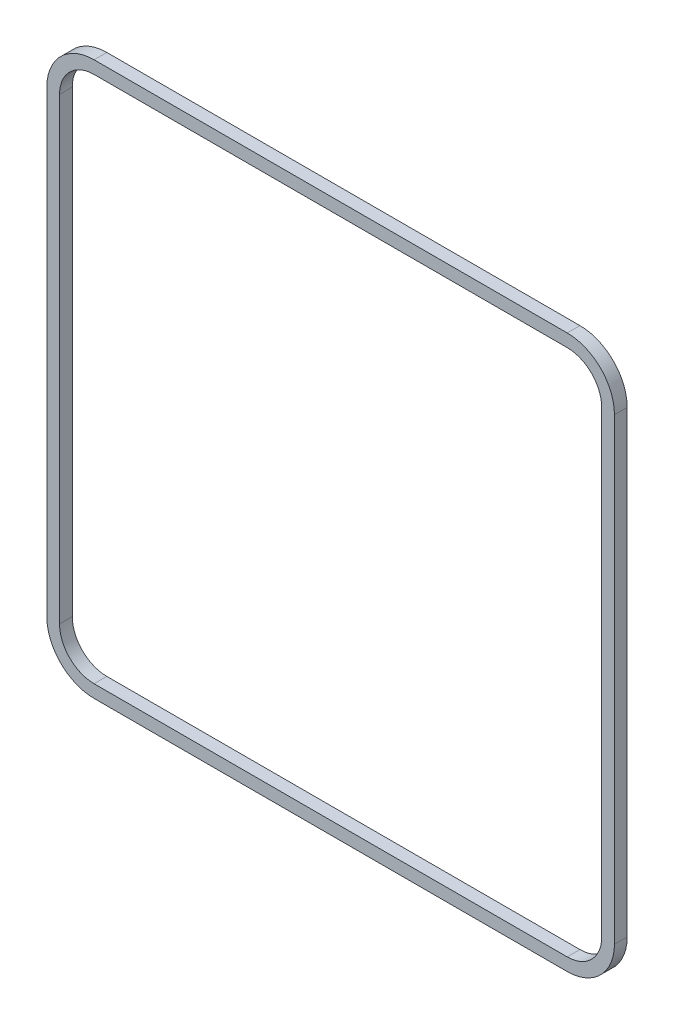
ISO-10303-21;
HEADER;
FILE_DESCRIPTION(('STEP AP214'),'2;1');
FILE_NAME('part.step','',(''),(''),'','','');
FILE_SCHEMA(('AUTOMOTIVE_DESIGN { 1 0 10303 214 1 1 1 1 }'));
ENDSEC;
DATA;
#1=APPLICATION_CONTEXT('core data for automotive mechanical design processes');
#2=APPLICATION_PROTOCOL_DEFINITION('international standard','automotive_design',2000,#1);
#3=PRODUCT_CONTEXT('',#1,'mechanical');
#4=PRODUCT('Part','Part','',(#3));
#5=PRODUCT_RELATED_PRODUCT_CATEGORY('part','',(#4));
#6=PRODUCT_DEFINITION_FORMATION('','',#4);
#7=PRODUCT_DEFINITION_CONTEXT('part definition',#1,'design');
#8=PRODUCT_DEFINITION('design','',#6,#7);
#9=PRODUCT_DEFINITION_SHAPE('','',#8);
#10=(LENGTH_UNIT() NAMED_UNIT(*) SI_UNIT(.MILLI.,.METRE.));
#11=(NAMED_UNIT(*) PLANE_ANGLE_UNIT() SI_UNIT($,.RADIAN.));
#12=(NAMED_UNIT(*) SI_UNIT($,.STERADIAN.) SOLID_ANGLE_UNIT());
#13=UNCERTAINTY_MEASURE_WITH_UNIT(LENGTH_MEASURE(1.E-05),#10,'distance_accuracy_value','');
#14=(GEOMETRIC_REPRESENTATION_CONTEXT(3) GLOBAL_UNCERTAINTY_ASSIGNED_CONTEXT((#13)) GLOBAL_UNIT_ASSIGNED_CONTEXT((#10,
#11,#12)) REPRESENTATION_CONTEXT('',''));
#15=CARTESIAN_POINT('',(0.,0.,0.));
#16=DIRECTION('',(0.,0.,1.));
#17=DIRECTION('',(1.,0.,0.));
#18=AXIS2_PLACEMENT_3D('',#15,#16,#17);
#19=CARTESIAN_POINT('',(4.7625,4.7625,1.778));
#20=DIRECTION('',(0.,0.,-1.));
#21=DIRECTION('',(-1.,0.,0.));
#22=AXIS2_PLACEMENT_3D('',#19,#20,#21);
#23=PLANE('',#22);
#24=CARTESIAN_POINT('',(4.7625,4.7625,1.778));
#25=DIRECTION('',(0.,0.,1.));
#26=DIRECTION('',(-1.,0.,0.));
#27=AXIS2_PLACEMENT_3D('',#24,#25,#26);
#28=CIRCLE('',#27,6.604);
#29=CARTESIAN_POINT('',(-1.8415,4.76250000000003,1.778));
#30=VERTEX_POINT('',#29);
#31=CARTESIAN_POINT('',(4.76250000000003,-1.8415,1.778));
#32=VERTEX_POINT('',#31);
#33=EDGE_CURVE('E213',#30,#32,#28,.T.);
#34=ORIENTED_EDGE('',*,*,#33,.T.);
#35=DIRECTION('',(1.,0.,0.));
#36=VECTOR('',#35,1.);
#37=CARTESIAN_POINT('',(4.76250000000003,-1.8415,1.778));
#38=LINE('',#37,#36);
#39=CARTESIAN_POINT('',(70.8787,-1.8415,1.778));
#40=VERTEX_POINT('',#39);
#41=EDGE_CURVE('E216',#32,#40,#38,.T.);
#42=ORIENTED_EDGE('',*,*,#41,.T.);
#43=CARTESIAN_POINT('',(70.8787,4.7625,1.778));
#44=DIRECTION('',(0.,0.,1.));
#45=DIRECTION('',(1.,0.,0.));
#46=AXIS2_PLACEMENT_3D('',#43,#44,#45);
#47=CIRCLE('',#46,6.604);
#48=CARTESIAN_POINT('',(77.4827,4.7625,1.778));
#49=VERTEX_POINT('',#48);
#50=EDGE_CURVE('E219',#40,#49,#47,.T.);
#51=ORIENTED_EDGE('',*,*,#50,.T.);
#52=DIRECTION('',(0.,1.,0.));
#53=VECTOR('',#52,1.);
#54=CARTESIAN_POINT('',(77.4827,4.7625,1.778));
#55=LINE('',#54,#53);
#56=CARTESIAN_POINT('',(77.4827,68.8467,1.778));
#57=VERTEX_POINT('',#56);
#58=EDGE_CURVE('E221',#49,#57,#55,.T.);
#59=ORIENTED_EDGE('',*,*,#58,.T.);
#60=CARTESIAN_POINT('',(70.8787,68.8467,1.778));
#61=DIRECTION('',(0.,0.,1.));
#62=DIRECTION('',(1.,0.,0.));
#63=AXIS2_PLACEMENT_3D('',#60,#61,#62);
#64=CIRCLE('',#63,6.604);
#65=CARTESIAN_POINT('',(70.8787,75.4507,1.778));
#66=VERTEX_POINT('',#65);
#67=EDGE_CURVE('E223',#57,#66,#64,.T.);
#68=ORIENTED_EDGE('',*,*,#67,.T.);
#69=DIRECTION('',(-1.,0.,0.));
#70=VECTOR('',#69,1.);
#71=CARTESIAN_POINT('',(4.76250000000005,75.4507,1.778));
#72=LINE('',#71,#70);
#73=CARTESIAN_POINT('',(4.76250000000005,75.4507,1.778));
#74=VERTEX_POINT('',#73);
#75=EDGE_CURVE('E225',#66,#74,#72,.T.);
#76=ORIENTED_EDGE('',*,*,#75,.T.);
#77=CARTESIAN_POINT('',(4.7625,68.8467,1.778));
#78=DIRECTION('',(0.,0.,1.));
#79=DIRECTION('',(1.,0.,0.));
#80=AXIS2_PLACEMENT_3D('',#77,#78,#79);
#81=CIRCLE('',#80,6.604);
#82=CARTESIAN_POINT('',(-1.8415,68.8467,1.778));
#83=VERTEX_POINT('',#82);
#84=EDGE_CURVE('E227',#74,#83,#81,.T.);
#85=ORIENTED_EDGE('',*,*,#84,.T.);
#86=DIRECTION('',(0.,-1.,0.));
#87=VECTOR('',#86,1.);
#88=CARTESIAN_POINT('',(-1.8415,4.76250000000003,1.778));
#89=LINE('',#88,#87);
#90=EDGE_CURVE('E229',#83,#30,#89,.T.);
#91=ORIENTED_EDGE('',*,*,#90,.T.);
#92=EDGE_LOOP('',(#34,#42,#51,#59,#68,#76,#85,#91));
#93=FACE_BOUND('',#92,.T.);
#94=CARTESIAN_POINT('',(4.7625,4.7625,1.778));
#95=DIRECTION('',(0.,0.,1.));
#96=DIRECTION('',(-1.,0.,0.));
#97=AXIS2_PLACEMENT_3D('',#94,#95,#96);
#98=CIRCLE('',#97,4.826);
#99=CARTESIAN_POINT('',(-0.0634999999999999,4.76250000000003,1.778));
#100=VERTEX_POINT('',#99);
#101=CARTESIAN_POINT('',(4.76250000000003,-0.0634999999999999,1.778));
#102=VERTEX_POINT('',#101);
#103=EDGE_CURVE('E148',#100,#102,#98,.T.);
#104=ORIENTED_EDGE('',*,*,#103,.F.);
#105=DIRECTION('',(0.,-1.,0.));
#106=VECTOR('',#105,1.);
#107=CARTESIAN_POINT('',(-0.0634999999999999,4.76250000000003,1.778));
#108=LINE('',#107,#106);
#109=CARTESIAN_POINT('',(-0.0635000000000002,68.8467,1.778));
#110=VERTEX_POINT('',#109);
#111=EDGE_CURVE('E181',#110,#100,#108,.T.);
#112=ORIENTED_EDGE('',*,*,#111,.F.);
#113=CARTESIAN_POINT('',(4.7625,68.8467,1.778));
#114=DIRECTION('',(0.,0.,1.));
#115=DIRECTION('',(1.,0.,0.));
#116=AXIS2_PLACEMENT_3D('',#113,#114,#115);
#117=CIRCLE('',#116,4.826);
#118=CARTESIAN_POINT('',(4.76250000000003,73.6727,1.778));
#119=VERTEX_POINT('',#118);
#120=EDGE_CURVE('E179',#119,#110,#117,.T.);
#121=ORIENTED_EDGE('',*,*,#120,.F.);
#122=DIRECTION('',(-1.,0.,0.));
#123=VECTOR('',#122,1.);
#124=CARTESIAN_POINT('',(4.76250000000003,73.6727,1.778));
#125=LINE('',#124,#123);
#126=CARTESIAN_POINT('',(70.8787,73.6727,1.778));
#127=VERTEX_POINT('',#126);
#128=EDGE_CURVE('E177',#127,#119,#125,.T.);
#129=ORIENTED_EDGE('',*,*,#128,.F.);
#130=CARTESIAN_POINT('',(70.8787,68.8467,1.778));
#131=DIRECTION('',(0.,0.,1.));
#132=DIRECTION('',(1.,0.,0.));
#133=AXIS2_PLACEMENT_3D('',#130,#131,#132);
#134=CIRCLE('',#133,4.826);
#135=CARTESIAN_POINT('',(75.7047,68.8467,1.778));
#136=VERTEX_POINT('',#135);
#137=EDGE_CURVE('E175',#136,#127,#134,.T.);
#138=ORIENTED_EDGE('',*,*,#137,.F.);
#139=DIRECTION('',(0.,1.,0.));
#140=VECTOR('',#139,1.);
#141=CARTESIAN_POINT('',(75.7047,4.76250000000003,1.778));
#142=LINE('',#141,#140);
#143=CARTESIAN_POINT('',(75.7047,4.76250000000003,1.778));
#144=VERTEX_POINT('',#143);
#145=EDGE_CURVE('E171',#144,#136,#142,.T.);
#146=ORIENTED_EDGE('',*,*,#145,.F.);
#147=CARTESIAN_POINT('',(70.8787,4.7625,1.778));
#148=DIRECTION('',(0.,0.,1.));
#149=DIRECTION('',(1.,0.,0.));
#150=AXIS2_PLACEMENT_3D('',#147,#148,#149);
#151=CIRCLE('',#150,4.826);
#152=CARTESIAN_POINT('',(70.8787,-0.0634999999999984,1.778));
#153=VERTEX_POINT('',#152);
#154=EDGE_CURVE('E169',#153,#144,#151,.T.);
#155=ORIENTED_EDGE('',*,*,#154,.F.);
#156=DIRECTION('',(1.,0.,0.));
#157=VECTOR('',#156,1.);
#158=CARTESIAN_POINT('',(4.76250000000003,-0.0634999999999999,1.778));
#159=LINE('',#158,#157);
#160=EDGE_CURVE('E156',#102,#153,#159,.T.);
#161=ORIENTED_EDGE('',*,*,#160,.F.);
#162=EDGE_LOOP('',(#104,#112,#121,#129,#138,#146,#155,#161));
#163=FACE_BOUND('',#162,.T.);
#164=ADVANCED_FACE('F35',(#93,#163),#23,.F.);
#165=CARTESIAN_POINT('',(4.7625,4.7625,0.));
#166=DIRECTION('',(0.,0.,-1.));
#167=DIRECTION('',(-1.,0.,0.));
#168=AXIS2_PLACEMENT_3D('',#165,#166,#167);
#169=PLANE('',#168);
#170=CARTESIAN_POINT('',(4.7625,4.7625,0.));
#171=DIRECTION('',(0.,0.,1.));
#172=DIRECTION('',(-1.,0.,0.));
#173=AXIS2_PLACEMENT_3D('',#170,#171,#172);
#174=CIRCLE('',#173,6.604);
#175=CARTESIAN_POINT('',(-1.8415,4.76250000000003,0.));
#176=VERTEX_POINT('',#175);
#177=CARTESIAN_POINT('',(4.76250000000003,-1.8415,0.));
#178=VERTEX_POINT('',#177);
#179=EDGE_CURVE('E164',#176,#178,#174,.T.);
#180=ORIENTED_EDGE('',*,*,#179,.F.);
#181=DIRECTION('',(0.,-1.,0.));
#182=VECTOR('',#181,1.);
#183=CARTESIAN_POINT('',(-1.8415,4.76250000000003,0.));
#184=LINE('',#183,#182);
#185=CARTESIAN_POINT('',(-1.8415,68.8467,0.));
#186=VERTEX_POINT('',#185);
#187=EDGE_CURVE('E217',#186,#176,#184,.T.);
#188=ORIENTED_EDGE('',*,*,#187,.F.);
#189=CARTESIAN_POINT('',(4.7625,68.8467,0.));
#190=DIRECTION('',(0.,0.,1.));
#191=DIRECTION('',(1.,0.,0.));
#192=AXIS2_PLACEMENT_3D('',#189,#190,#191);
#193=CIRCLE('',#192,6.604);
#194=CARTESIAN_POINT('',(4.76250000000005,75.4507,0.));
#195=VERTEX_POINT('',#194);
#196=EDGE_CURVE('E244',#195,#186,#193,.T.);
#197=ORIENTED_EDGE('',*,*,#196,.F.);
#198=DIRECTION('',(-1.,0.,0.));
#199=VECTOR('',#198,1.);
#200=CARTESIAN_POINT('',(4.76250000000005,75.4507,0.));
#201=LINE('',#200,#199);
#202=CARTESIAN_POINT('',(70.8787,75.4507,0.));
#203=VERTEX_POINT('',#202);
#204=EDGE_CURVE('E242',#203,#195,#201,.T.);
#205=ORIENTED_EDGE('',*,*,#204,.F.);
#206=CARTESIAN_POINT('',(70.8787,68.8467,0.));
#207=DIRECTION('',(0.,0.,1.));
#208=DIRECTION('',(1.,0.,0.));
#209=AXIS2_PLACEMENT_3D('',#206,#207,#208);
#210=CIRCLE('',#209,6.604);
#211=CARTESIAN_POINT('',(77.4827,68.8467,0.));
#212=VERTEX_POINT('',#211);
#213=EDGE_CURVE('E240',#212,#203,#210,.T.);
#214=ORIENTED_EDGE('',*,*,#213,.F.);
#215=DIRECTION('',(0.,1.,0.));
#216=VECTOR('',#215,1.);
#217=CARTESIAN_POINT('',(77.4827,4.7625,0.));
#218=LINE('',#217,#216);
#219=CARTESIAN_POINT('',(77.4827,4.7625,0.));
#220=VERTEX_POINT('',#219);
#221=EDGE_CURVE('E238',#220,#212,#218,.T.);
#222=ORIENTED_EDGE('',*,*,#221,.F.);
#223=CARTESIAN_POINT('',(70.8787,4.7625,0.));
#224=DIRECTION('',(0.,0.,1.));
#225=DIRECTION('',(1.,0.,0.));
#226=AXIS2_PLACEMENT_3D('',#223,#224,#225);
#227=CIRCLE('',#226,6.604);
#228=CARTESIAN_POINT('',(70.8787,-1.8415,0.));
#229=VERTEX_POINT('',#228);
#230=EDGE_CURVE('E236',#229,#220,#227,.T.);
#231=ORIENTED_EDGE('',*,*,#230,.F.);
#232=DIRECTION('',(1.,0.,0.));
#233=VECTOR('',#232,1.);
#234=CARTESIAN_POINT('',(4.76250000000003,-1.8415,0.));
#235=LINE('',#234,#233);
#236=EDGE_CURVE('E234',#178,#229,#235,.T.);
#237=ORIENTED_EDGE('',*,*,#236,.F.);
#238=EDGE_LOOP('',(#180,#188,#197,#205,#214,#222,#231,#237));
#239=FACE_BOUND('',#238,.T.);
#240=DIRECTION('',(0.,-1.,0.));
#241=VECTOR('',#240,1.);
#242=CARTESIAN_POINT('',(-0.0634999999999999,4.76250000000003,0.));
#243=LINE('',#242,#241);
#244=CARTESIAN_POINT('',(-0.0634999999999999,68.8467,0.));
#245=VERTEX_POINT('',#244);
#246=CARTESIAN_POINT('',(-0.0635000000000002,4.76250000000003,0.));
#247=VERTEX_POINT('',#246);
#248=EDGE_CURVE('E157',#245,#247,#243,.T.);
#249=ORIENTED_EDGE('',*,*,#248,.T.);
#250=CARTESIAN_POINT('',(4.7625,4.7625,0.));
#251=DIRECTION('',(0.,0.,1.));
#252=DIRECTION('',(-1.,0.,0.));
#253=AXIS2_PLACEMENT_3D('',#250,#251,#252);
#254=CIRCLE('',#253,4.826);
#255=CARTESIAN_POINT('',(4.76250000000003,-0.0634999999999999,0.));
#256=VERTEX_POINT('',#255);
#257=EDGE_CURVE('E58',#247,#256,#254,.T.);
#258=ORIENTED_EDGE('',*,*,#257,.T.);
#259=DIRECTION('',(1.,0.,0.));
#260=VECTOR('',#259,1.);
#261=CARTESIAN_POINT('',(4.76250000000003,-0.0634999999999999,0.));
#262=LINE('',#261,#260);
#263=CARTESIAN_POINT('',(70.8787,-0.0634999999999984,0.));
#264=VERTEX_POINT('',#263);
#265=EDGE_CURVE('E163',#256,#264,#262,.T.);
#266=ORIENTED_EDGE('',*,*,#265,.T.);
#267=CARTESIAN_POINT('',(70.8787,4.7625,0.));
#268=DIRECTION('',(0.,0.,1.));
#269=DIRECTION('',(1.,0.,0.));
#270=AXIS2_PLACEMENT_3D('',#267,#268,#269);
#271=CIRCLE('',#270,4.826);
#272=CARTESIAN_POINT('',(75.7047,4.76250000000003,0.));
#273=VERTEX_POINT('',#272);
#274=EDGE_CURVE('E185',#264,#273,#271,.T.);
#275=ORIENTED_EDGE('',*,*,#274,.T.);
#276=DIRECTION('',(0.,1.,0.));
#277=VECTOR('',#276,1.);
#278=CARTESIAN_POINT('',(75.7047,4.76250000000003,0.));
#279=LINE('',#278,#277);
#280=CARTESIAN_POINT('',(75.7047,68.8467,0.));
#281=VERTEX_POINT('',#280);
#282=EDGE_CURVE('E188',#273,#281,#279,.T.);
#283=ORIENTED_EDGE('',*,*,#282,.T.);
#284=CARTESIAN_POINT('',(70.8787,68.8467,0.));
#285=DIRECTION('',(0.,0.,1.));
#286=DIRECTION('',(1.,0.,0.));
#287=AXIS2_PLACEMENT_3D('',#284,#285,#286);
#288=CIRCLE('',#287,4.826);
#289=CARTESIAN_POINT('',(70.8787,73.6727,0.));
#290=VERTEX_POINT('',#289);
#291=EDGE_CURVE('E191',#281,#290,#288,.T.);
#292=ORIENTED_EDGE('',*,*,#291,.T.);
#293=DIRECTION('',(-1.,0.,0.));
#294=VECTOR('',#293,1.);
#295=CARTESIAN_POINT('',(4.76250000000003,73.6727,0.));
#296=LINE('',#295,#294);
#297=CARTESIAN_POINT('',(4.76250000000003,73.6727,0.));
#298=VERTEX_POINT('',#297);
#299=EDGE_CURVE('E194',#290,#298,#296,.T.);
#300=ORIENTED_EDGE('',*,*,#299,.T.);
#301=CARTESIAN_POINT('',(4.7625,68.8467,0.));
#302=DIRECTION('',(0.,0.,1.));
#303=DIRECTION('',(1.,0.,0.));
#304=AXIS2_PLACEMENT_3D('',#301,#302,#303);
#305=CIRCLE('',#304,4.826);
#306=EDGE_CURVE('E197',#298,#245,#305,.T.);
#307=ORIENTED_EDGE('',*,*,#306,.T.);
#308=EDGE_LOOP('',(#249,#258,#266,#275,#283,#292,#300,#307));
#309=FACE_BOUND('',#308,.T.);
#310=ADVANCED_FACE('F274',(#239,#309),#169,.T.);
#311=CARTESIAN_POINT('',(4.7625,4.7625,1.778));
#312=DIRECTION('',(0.,0.,-1.));
#313=DIRECTION('',(-1.,0.,0.));
#314=AXIS2_PLACEMENT_3D('',#311,#312,#313);
#315=CYLINDRICAL_SURFACE('',#314,6.604);
#316=ORIENTED_EDGE('',*,*,#179,.T.);
#317=DIRECTION('',(0.,0.,-1.));
#318=VECTOR('',#317,1.);
#319=CARTESIAN_POINT('',(4.76250000000003,-1.8415,1.778));
#320=LINE('',#319,#318);
#321=EDGE_CURVE('E11',#32,#178,#320,.T.);
#322=ORIENTED_EDGE('',*,*,#321,.F.);
#323=ORIENTED_EDGE('',*,*,#33,.F.);
#324=DIRECTION('',(0.,0.,-1.));
#325=VECTOR('',#324,1.);
#326=CARTESIAN_POINT('',(-1.8415,4.76250000000003,1.778));
#327=LINE('',#326,#325);
#328=EDGE_CURVE('E231',#30,#176,#327,.T.);
#329=ORIENTED_EDGE('',*,*,#328,.T.);
#330=EDGE_LOOP('',(#316,#322,#323,#329));
#331=FACE_BOUND('',#330,.T.);
#332=ADVANCED_FACE('F37',(#331),#315,.T.);
#333=CARTESIAN_POINT('',(4.76250000000003,-1.8415,1.778));
#334=DIRECTION('',(0.,1.,0.));
#335=DIRECTION('',(-1.,0.,0.));
#336=AXIS2_PLACEMENT_3D('',#333,#334,#335);
#337=PLANE('',#336);
#338=ORIENTED_EDGE('',*,*,#236,.T.);
#339=DIRECTION('',(0.,0.,-1.));
#340=VECTOR('',#339,1.);
#341=CARTESIAN_POINT('',(70.8787,-1.8415,1.778));
#342=LINE('',#341,#340);
#343=EDGE_CURVE('E43',#40,#229,#342,.T.);
#344=ORIENTED_EDGE('',*,*,#343,.F.);
#345=ORIENTED_EDGE('',*,*,#41,.F.);
#346=ORIENTED_EDGE('',*,*,#321,.T.);
#347=EDGE_LOOP('',(#338,#344,#345,#346));
#348=FACE_BOUND('',#347,.T.);
#349=ADVANCED_FACE('F291',(#348),#337,.F.);
#350=CARTESIAN_POINT('',(70.8787,4.7625,1.778));
#351=DIRECTION('',(0.,0.,-1.));
#352=DIRECTION('',(-1.,0.,0.));
#353=AXIS2_PLACEMENT_3D('',#350,#351,#352);
#354=CYLINDRICAL_SURFACE('',#353,6.604);
#355=ORIENTED_EDGE('',*,*,#230,.T.);
#356=DIRECTION('',(0.,0.,-1.));
#357=VECTOR('',#356,1.);
#358=CARTESIAN_POINT('',(77.4827,4.7625,1.778));
#359=LINE('',#358,#357);
#360=EDGE_CURVE('E261',#49,#220,#359,.T.);
#361=ORIENTED_EDGE('',*,*,#360,.F.);
#362=ORIENTED_EDGE('',*,*,#50,.F.);
#363=ORIENTED_EDGE('',*,*,#343,.T.);
#364=EDGE_LOOP('',(#355,#361,#362,#363));
#365=FACE_BOUND('',#364,.T.);
#366=ADVANCED_FACE('F268',(#365),#354,.T.);
#367=CARTESIAN_POINT('',(77.4827,4.7625,1.778));
#368=DIRECTION('',(-1.,0.,0.));
#369=DIRECTION('',(0.,-1.,0.));
#370=AXIS2_PLACEMENT_3D('',#367,#368,#369);
#371=PLANE('',#370);
#372=ORIENTED_EDGE('',*,*,#221,.T.);
#373=DIRECTION('',(0.,0.,-1.));
#374=VECTOR('',#373,1.);
#375=CARTESIAN_POINT('',(77.4827,68.8467,1.778));
#376=LINE('',#375,#374);
#377=EDGE_CURVE('E258',#57,#212,#376,.T.);
#378=ORIENTED_EDGE('',*,*,#377,.F.);
#379=ORIENTED_EDGE('',*,*,#58,.F.);
#380=ORIENTED_EDGE('',*,*,#360,.T.);
#381=EDGE_LOOP('',(#372,#378,#379,#380));
#382=FACE_BOUND('',#381,.T.);
#383=ADVANCED_FACE('F280',(#382),#371,.F.);
#384=CARTESIAN_POINT('',(70.8787,68.8467,1.778));
#385=DIRECTION('',(0.,0.,-1.));
#386=DIRECTION('',(-1.,0.,0.));
#387=AXIS2_PLACEMENT_3D('',#384,#385,#386);
#388=CYLINDRICAL_SURFACE('',#387,6.604);
#389=ORIENTED_EDGE('',*,*,#213,.T.);
#390=DIRECTION('',(0.,0.,-1.));
#391=VECTOR('',#390,1.);
#392=CARTESIAN_POINT('',(70.8787,75.4507,1.778));
#393=LINE('',#392,#391);
#394=EDGE_CURVE('E255',#66,#203,#393,.T.);
#395=ORIENTED_EDGE('',*,*,#394,.F.);
#396=ORIENTED_EDGE('',*,*,#67,.F.);
#397=ORIENTED_EDGE('',*,*,#377,.T.);
#398=EDGE_LOOP('',(#389,#395,#396,#397));
#399=FACE_BOUND('',#398,.T.);
#400=ADVANCED_FACE('F284',(#399),#388,.T.);
#401=CARTESIAN_POINT('',(4.76250000000005,75.4507,1.778));
#402=DIRECTION('',(0.,-1.,0.));
#403=DIRECTION('',(0.,0.,-1.));
#404=AXIS2_PLACEMENT_3D('',#401,#402,#403);
#405=PLANE('',#404);
#406=ORIENTED_EDGE('',*,*,#204,.T.);
#407=DIRECTION('',(0.,0.,-1.));
#408=VECTOR('',#407,1.);
#409=CARTESIAN_POINT('',(4.76250000000005,75.4507,1.778));
#410=LINE('',#409,#408);
#411=EDGE_CURVE('E252',#74,#195,#410,.T.);
#412=ORIENTED_EDGE('',*,*,#411,.F.);
#413=ORIENTED_EDGE('',*,*,#75,.F.);
#414=ORIENTED_EDGE('',*,*,#394,.T.);
#415=EDGE_LOOP('',(#406,#412,#413,#414));
#416=FACE_BOUND('',#415,.T.);
#417=ADVANCED_FACE('F304',(#416),#405,.F.);
#418=CARTESIAN_POINT('',(4.7625,68.8467,1.778));
#419=DIRECTION('',(0.,0.,-1.));
#420=DIRECTION('',(-1.,0.,0.));
#421=AXIS2_PLACEMENT_3D('',#418,#419,#420);
#422=CYLINDRICAL_SURFACE('',#421,6.604);
#423=ORIENTED_EDGE('',*,*,#196,.T.);
#424=DIRECTION('',(0.,0.,-1.));
#425=VECTOR('',#424,1.);
#426=CARTESIAN_POINT('',(-1.8415,68.8467,1.778));
#427=LINE('',#426,#425);
#428=EDGE_CURVE('E249',#83,#186,#427,.T.);
#429=ORIENTED_EDGE('',*,*,#428,.F.);
#430=ORIENTED_EDGE('',*,*,#84,.F.);
#431=ORIENTED_EDGE('',*,*,#411,.T.);
#432=EDGE_LOOP('',(#423,#429,#430,#431));
#433=FACE_BOUND('',#432,.T.);
#434=ADVANCED_FACE('F302',(#433),#422,.T.);
#435=CARTESIAN_POINT('',(-1.8415,4.76250000000003,1.778));
#436=DIRECTION('',(1.,0.,0.));
#437=DIRECTION('',(0.,0.,-1.));
#438=AXIS2_PLACEMENT_3D('',#435,#436,#437);
#439=PLANE('',#438);
#440=ORIENTED_EDGE('',*,*,#187,.T.);
#441=ORIENTED_EDGE('',*,*,#328,.F.);
#442=ORIENTED_EDGE('',*,*,#90,.F.);
#443=ORIENTED_EDGE('',*,*,#428,.T.);
#444=EDGE_LOOP('',(#440,#441,#442,#443));
#445=FACE_BOUND('',#444,.T.);
#446=ADVANCED_FACE('F297',(#445),#439,.F.);
#447=CARTESIAN_POINT('',(4.7625,4.7625,1.778));
#448=DIRECTION('',(0.,0.,-1.));
#449=DIRECTION('',(-1.,0.,0.));
#450=AXIS2_PLACEMENT_3D('',#447,#448,#449);
#451=CYLINDRICAL_SURFACE('',#450,4.826);
#452=ORIENTED_EDGE('',*,*,#257,.F.);
#453=DIRECTION('',(0.,0.,-1.));
#454=VECTOR('',#453,1.);
#455=CARTESIAN_POINT('',(-0.0634999999999999,4.76250000000003,1.778));
#456=LINE('',#455,#454);
#457=EDGE_CURVE('E152',#100,#247,#456,.T.);
#458=ORIENTED_EDGE('',*,*,#457,.F.);
#459=ORIENTED_EDGE('',*,*,#103,.T.);
#460=DIRECTION('',(0.,0.,-1.));
#461=VECTOR('',#460,1.);
#462=CARTESIAN_POINT('',(4.76250000000003,-0.0634999999999999,1.778));
#463=LINE('',#462,#461);
#464=EDGE_CURVE('E151',#102,#256,#463,.T.);
#465=ORIENTED_EDGE('',*,*,#464,.T.);
#466=EDGE_LOOP('',(#452,#458,#459,#465));
#467=FACE_BOUND('',#466,.T.);
#468=ADVANCED_FACE('F150',(#467),#451,.F.);
#469=CARTESIAN_POINT('',(4.76250000000003,-0.0634999999999999,1.778));
#470=DIRECTION('',(0.,1.,0.));
#471=DIRECTION('',(-1.,0.,0.));
#472=AXIS2_PLACEMENT_3D('',#469,#470,#471);
#473=PLANE('',#472);
#474=ORIENTED_EDGE('',*,*,#265,.F.);
#475=ORIENTED_EDGE('',*,*,#464,.F.);
#476=ORIENTED_EDGE('',*,*,#160,.T.);
#477=DIRECTION('',(0.,0.,-1.));
#478=VECTOR('',#477,1.);
#479=CARTESIAN_POINT('',(70.8787,-0.0634999999999984,1.778));
#480=LINE('',#479,#478);
#481=EDGE_CURVE('E165',#153,#264,#480,.T.);
#482=ORIENTED_EDGE('',*,*,#481,.T.);
#483=EDGE_LOOP('',(#474,#475,#476,#482));
#484=FACE_BOUND('',#483,.T.);
#485=ADVANCED_FACE('F160',(#484),#473,.T.);
#486=CARTESIAN_POINT('',(70.8787,4.7625,1.778));
#487=DIRECTION('',(0.,0.,-1.));
#488=DIRECTION('',(-1.,0.,0.));
#489=AXIS2_PLACEMENT_3D('',#486,#487,#488);
#490=CYLINDRICAL_SURFACE('',#489,4.826);
#491=ORIENTED_EDGE('',*,*,#274,.F.);
#492=ORIENTED_EDGE('',*,*,#481,.F.);
#493=ORIENTED_EDGE('',*,*,#154,.T.);
#494=DIRECTION('',(0.,0.,-1.));
#495=VECTOR('',#494,1.);
#496=CARTESIAN_POINT('',(75.7047,4.76250000000003,1.778));
#497=LINE('',#496,#495);
#498=EDGE_CURVE('E210',#144,#273,#497,.T.);
#499=ORIENTED_EDGE('',*,*,#498,.T.);
#500=EDGE_LOOP('',(#491,#492,#493,#499));
#501=FACE_BOUND('',#500,.T.);
#502=ADVANCED_FACE('F329',(#501),#490,.F.);
#503=CARTESIAN_POINT('',(75.7047,4.76250000000003,1.778));
#504=DIRECTION('',(-1.,0.,0.));
#505=DIRECTION('',(0.,0.,1.));
#506=AXIS2_PLACEMENT_3D('',#503,#504,#505);
#507=PLANE('',#506);
#508=ORIENTED_EDGE('',*,*,#282,.F.);
#509=ORIENTED_EDGE('',*,*,#498,.F.);
#510=ORIENTED_EDGE('',*,*,#145,.T.);
#511=DIRECTION('',(0.,0.,-1.));
#512=VECTOR('',#511,1.);
#513=CARTESIAN_POINT('',(75.7047,68.8467,1.778));
#514=LINE('',#513,#512);
#515=EDGE_CURVE('E208',#136,#281,#514,.T.);
#516=ORIENTED_EDGE('',*,*,#515,.T.);
#517=EDGE_LOOP('',(#508,#509,#510,#516));
#518=FACE_BOUND('',#517,.T.);
#519=ADVANCED_FACE('F333',(#518),#507,.T.);
#520=CARTESIAN_POINT('',(70.8787,68.8467,1.778));
#521=DIRECTION('',(0.,0.,-1.));
#522=DIRECTION('',(-1.,0.,0.));
#523=AXIS2_PLACEMENT_3D('',#520,#521,#522);
#524=CYLINDRICAL_SURFACE('',#523,4.826);
#525=ORIENTED_EDGE('',*,*,#291,.F.);
#526=ORIENTED_EDGE('',*,*,#515,.F.);
#527=ORIENTED_EDGE('',*,*,#137,.T.);
#528=DIRECTION('',(0.,0.,-1.));
#529=VECTOR('',#528,1.);
#530=CARTESIAN_POINT('',(70.8787,73.6727,1.778));
#531=LINE('',#530,#529);
#532=EDGE_CURVE('E206',#127,#290,#531,.T.);
#533=ORIENTED_EDGE('',*,*,#532,.T.);
#534=EDGE_LOOP('',(#525,#526,#527,#533));
#535=FACE_BOUND('',#534,.T.);
#536=ADVANCED_FACE('F339',(#535),#524,.F.);
#537=CARTESIAN_POINT('',(4.76250000000003,73.6727,1.778));
#538=DIRECTION('',(0.,-1.,0.));
#539=DIRECTION('',(0.,0.,-1.));
#540=AXIS2_PLACEMENT_3D('',#537,#538,#539);
#541=PLANE('',#540);
#542=ORIENTED_EDGE('',*,*,#299,.F.);
#543=ORIENTED_EDGE('',*,*,#532,.F.);
#544=ORIENTED_EDGE('',*,*,#128,.T.);
#545=DIRECTION('',(0.,0.,-1.));
#546=VECTOR('',#545,1.);
#547=CARTESIAN_POINT('',(4.76250000000003,73.6727,1.778));
#548=LINE('',#547,#546);
#549=EDGE_CURVE('E204',#119,#298,#548,.T.);
#550=ORIENTED_EDGE('',*,*,#549,.T.);
#551=EDGE_LOOP('',(#542,#543,#544,#550));
#552=FACE_BOUND('',#551,.T.);
#553=ADVANCED_FACE('F343',(#552),#541,.T.);
#554=CARTESIAN_POINT('',(4.7625,68.8467,1.778));
#555=DIRECTION('',(0.,0.,-1.));
#556=DIRECTION('',(-1.,0.,0.));
#557=AXIS2_PLACEMENT_3D('',#554,#555,#556);
#558=CYLINDRICAL_SURFACE('',#557,4.826);
#559=ORIENTED_EDGE('',*,*,#306,.F.);
#560=ORIENTED_EDGE('',*,*,#549,.F.);
#561=ORIENTED_EDGE('',*,*,#120,.T.);
#562=DIRECTION('',(0.,0.,-1.));
#563=VECTOR('',#562,1.);
#564=CARTESIAN_POINT('',(-0.0634999999999999,68.8467,1.778));
#565=LINE('',#564,#563);
#566=EDGE_CURVE('E50',#110,#245,#565,.T.);
#567=ORIENTED_EDGE('',*,*,#566,.T.);
#568=EDGE_LOOP('',(#559,#560,#561,#567));
#569=FACE_BOUND('',#568,.T.);
#570=ADVANCED_FACE('F347',(#569),#558,.F.);
#571=CARTESIAN_POINT('',(-0.0634999999999999,4.76250000000003,1.778));
#572=DIRECTION('',(1.,0.,0.));
#573=DIRECTION('',(0.,0.,-1.));
#574=AXIS2_PLACEMENT_3D('',#571,#572,#573);
#575=PLANE('',#574);
#576=ORIENTED_EDGE('',*,*,#248,.F.);
#577=ORIENTED_EDGE('',*,*,#566,.F.);
#578=ORIENTED_EDGE('',*,*,#111,.T.);
#579=ORIENTED_EDGE('',*,*,#457,.T.);
#580=EDGE_LOOP('',(#576,#577,#578,#579));
#581=FACE_BOUND('',#580,.T.);
#582=ADVANCED_FACE('F351',(#581),#575,.T.);
#583=CLOSED_SHELL('',(#164,#310,#332,#349,#366,#383,#400,#417,#434,#446,#468,#485,#502,#519,
#536,#553,#570,#582));
#584=MANIFOLD_SOLID_BREP('B2',#583);
#585=ADVANCED_BREP_SHAPE_REPRESENTATION('',(#18,#584),#14);
#586=SHAPE_DEFINITION_REPRESENTATION(#9,#585);
ENDSEC;
END-ISO-10303-21;
